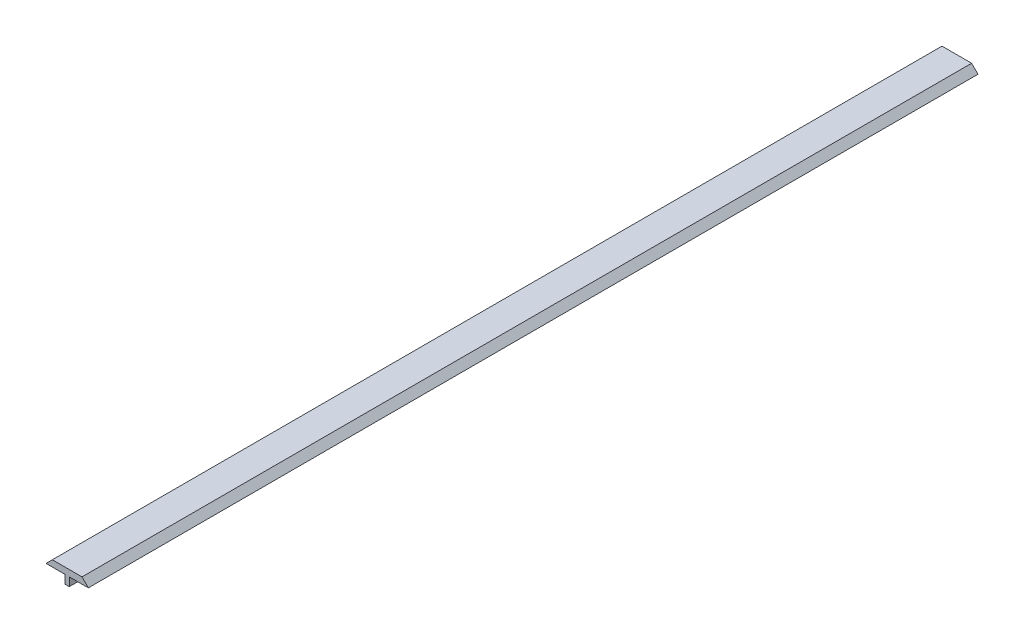
ISO-10303-21;
HEADER;
FILE_DESCRIPTION(('STEP AP214'),'2;1');
FILE_NAME('part.step','',(''),(''),'','','');
FILE_SCHEMA(('AUTOMOTIVE_DESIGN { 1 0 10303 214 1 1 1 1 }'));
ENDSEC;
DATA;
#1=APPLICATION_CONTEXT('core data for automotive mechanical design processes');
#2=APPLICATION_PROTOCOL_DEFINITION('international standard','automotive_design',2000,#1);
#3=PRODUCT_CONTEXT('',#1,'mechanical');
#4=PRODUCT('Part','Part','',(#3));
#5=PRODUCT_RELATED_PRODUCT_CATEGORY('part','',(#4));
#6=PRODUCT_DEFINITION_FORMATION('','',#4);
#7=PRODUCT_DEFINITION_CONTEXT('part definition',#1,'design');
#8=PRODUCT_DEFINITION('design','',#6,#7);
#9=PRODUCT_DEFINITION_SHAPE('','',#8);
#10=(LENGTH_UNIT() NAMED_UNIT(*) SI_UNIT(.MILLI.,.METRE.));
#11=(NAMED_UNIT(*) PLANE_ANGLE_UNIT() SI_UNIT($,.RADIAN.));
#12=(NAMED_UNIT(*) SI_UNIT($,.STERADIAN.) SOLID_ANGLE_UNIT());
#13=UNCERTAINTY_MEASURE_WITH_UNIT(LENGTH_MEASURE(1.E-05),#10,'distance_accuracy_value','');
#14=(GEOMETRIC_REPRESENTATION_CONTEXT(3) GLOBAL_UNCERTAINTY_ASSIGNED_CONTEXT((#13)) GLOBAL_UNIT_ASSIGNED_CONTEXT((#10,
#11,#12)) REPRESENTATION_CONTEXT('',''));
#15=CARTESIAN_POINT('',(0.,0.,0.));
#16=DIRECTION('',(0.,0.,1.));
#17=DIRECTION('',(1.,0.,0.));
#18=AXIS2_PLACEMENT_3D('',#15,#16,#17);
#19=CARTESIAN_POINT('',(0.,2.,210.));
#20=DIRECTION('',(1.,0.,0.));
#21=DIRECTION('',(0.,0.,-1.));
#22=AXIS2_PLACEMENT_3D('',#19,#20,#21);
#23=PLANE('',#22);
#24=DIRECTION('',(0.,-1.,0.));
#25=VECTOR('',#24,1.);
#26=CARTESIAN_POINT('',(0.,2.,0.));
#27=LINE('',#26,#25);
#28=CARTESIAN_POINT('',(0.,2.,0.));
#29=VERTEX_POINT('',#28);
#30=CARTESIAN_POINT('',(0.,0.,0.));
#31=VERTEX_POINT('',#30);
#32=EDGE_CURVE('E146',#29,#31,#27,.T.);
#33=ORIENTED_EDGE('',*,*,#32,.T.);
#34=DIRECTION('',(0.,0.,-1.));
#35=VECTOR('',#34,1.);
#36=CARTESIAN_POINT('',(0.,0.,210.));
#37=LINE('',#36,#35);
#38=CARTESIAN_POINT('',(0.,0.,210.));
#39=VERTEX_POINT('',#38);
#40=EDGE_CURVE('E11',#39,#31,#37,.T.);
#41=ORIENTED_EDGE('',*,*,#40,.F.);
#42=DIRECTION('',(0.,-1.,0.));
#43=VECTOR('',#42,1.);
#44=CARTESIAN_POINT('',(0.,2.,210.));
#45=LINE('',#44,#43);
#46=CARTESIAN_POINT('',(0.,2.,210.));
#47=VERTEX_POINT('',#46);
#48=EDGE_CURVE('E168',#47,#39,#45,.T.);
#49=ORIENTED_EDGE('',*,*,#48,.F.);
#50=DIRECTION('',(0.,0.,-1.));
#51=VECTOR('',#50,1.);
#52=CARTESIAN_POINT('',(0.,2.,210.));
#53=LINE('',#52,#51);
#54=EDGE_CURVE('E142',#47,#29,#53,.T.);
#55=ORIENTED_EDGE('',*,*,#54,.T.);
#56=EDGE_LOOP('',(#33,#41,#49,#55));
#57=FACE_BOUND('',#56,.T.);
#58=ADVANCED_FACE('F45',(#57),#23,.F.);
#59=CARTESIAN_POINT('',(0.,0.,210.));
#60=DIRECTION('',(0.,1.,0.));
#61=DIRECTION('',(0.,0.,1.));
#62=AXIS2_PLACEMENT_3D('',#59,#60,#61);
#63=PLANE('',#62);
#64=DIRECTION('',(1.,0.,0.));
#65=VECTOR('',#64,1.);
#66=CARTESIAN_POINT('',(0.,0.,0.));
#67=LINE('',#66,#65);
#68=CARTESIAN_POINT('',(1.,0.,0.));
#69=VERTEX_POINT('',#68);
#70=EDGE_CURVE('E150',#31,#69,#67,.T.);
#71=ORIENTED_EDGE('',*,*,#70,.T.);
#72=DIRECTION('',(0.,0.,-1.));
#73=VECTOR('',#72,1.);
#74=CARTESIAN_POINT('',(1.,0.,210.));
#75=LINE('',#74,#73);
#76=CARTESIAN_POINT('',(1.,0.,210.));
#77=VERTEX_POINT('',#76);
#78=EDGE_CURVE('E54',#77,#69,#75,.T.);
#79=ORIENTED_EDGE('',*,*,#78,.F.);
#80=DIRECTION('',(1.,0.,0.));
#81=VECTOR('',#80,1.);
#82=CARTESIAN_POINT('',(0.,0.,210.));
#83=LINE('',#82,#81);
#84=EDGE_CURVE('E105',#39,#77,#83,.T.);
#85=ORIENTED_EDGE('',*,*,#84,.F.);
#86=ORIENTED_EDGE('',*,*,#40,.T.);
#87=EDGE_LOOP('',(#71,#79,#85,#86));
#88=FACE_BOUND('',#87,.T.);
#89=ADVANCED_FACE('F214',(#88),#63,.F.);
#90=CARTESIAN_POINT('',(1.,0.,210.));
#91=DIRECTION('',(-1.,0.,0.));
#92=DIRECTION('',(0.,0.,1.));
#93=AXIS2_PLACEMENT_3D('',#90,#91,#92);
#94=PLANE('',#93);
#95=DIRECTION('',(0.,1.,0.));
#96=VECTOR('',#95,1.);
#97=CARTESIAN_POINT('',(1.,0.,0.));
#98=LINE('',#97,#96);
#99=CARTESIAN_POINT('',(1.,2.,0.));
#100=VERTEX_POINT('',#99);
#101=EDGE_CURVE('E153',#69,#100,#98,.T.);
#102=ORIENTED_EDGE('',*,*,#101,.T.);
#103=DIRECTION('',(0.,0.,-1.));
#104=VECTOR('',#103,1.);
#105=CARTESIAN_POINT('',(1.,2.,210.));
#106=LINE('',#105,#104);
#107=CARTESIAN_POINT('',(1.,2.,210.));
#108=VERTEX_POINT('',#107);
#109=EDGE_CURVE('E179',#108,#100,#106,.T.);
#110=ORIENTED_EDGE('',*,*,#109,.F.);
#111=DIRECTION('',(0.,1.,0.));
#112=VECTOR('',#111,1.);
#113=CARTESIAN_POINT('',(1.,0.,210.));
#114=LINE('',#113,#112);
#115=EDGE_CURVE('E189',#77,#108,#114,.T.);
#116=ORIENTED_EDGE('',*,*,#115,.F.);
#117=ORIENTED_EDGE('',*,*,#78,.T.);
#118=EDGE_LOOP('',(#102,#110,#116,#117));
#119=FACE_BOUND('',#118,.T.);
#120=ADVANCED_FACE('F187',(#119),#94,.F.);
#121=CARTESIAN_POINT('',(1.,2.,210.));
#122=DIRECTION('',(0.,1.,0.));
#123=DIRECTION('',(0.,0.,1.));
#124=AXIS2_PLACEMENT_3D('',#121,#122,#123);
#125=PLANE('',#124);
#126=DIRECTION('',(1.,0.,0.));
#127=VECTOR('',#126,1.);
#128=CARTESIAN_POINT('',(1.,2.,0.));
#129=LINE('',#128,#127);
#130=CARTESIAN_POINT('',(5.5,2.,0.));
#131=VERTEX_POINT('',#130);
#132=EDGE_CURVE('E156',#100,#131,#129,.T.);
#133=ORIENTED_EDGE('',*,*,#132,.T.);
#134=DIRECTION('',(0.,0.,-1.));
#135=VECTOR('',#134,1.);
#136=CARTESIAN_POINT('',(5.5,2.,210.));
#137=LINE('',#136,#135);
#138=CARTESIAN_POINT('',(5.5,2.,210.));
#139=VERTEX_POINT('',#138);
#140=EDGE_CURVE('E175',#139,#131,#137,.T.);
#141=ORIENTED_EDGE('',*,*,#140,.F.);
#142=DIRECTION('',(1.,0.,0.));
#143=VECTOR('',#142,1.);
#144=CARTESIAN_POINT('',(1.,2.,210.));
#145=LINE('',#144,#143);
#146=EDGE_CURVE('E202',#108,#139,#145,.T.);
#147=ORIENTED_EDGE('',*,*,#146,.F.);
#148=ORIENTED_EDGE('',*,*,#109,.T.);
#149=EDGE_LOOP('',(#133,#141,#147,#148));
#150=FACE_BOUND('',#149,.T.);
#151=ADVANCED_FACE('F197',(#150),#125,.F.);
#152=CARTESIAN_POINT('',(5.5,2.,210.));
#153=DIRECTION('',(-0.707106781186547,-0.707106781186548,0.));
#154=DIRECTION('',(0.707106781186548,-0.707106781186547,0.));
#155=AXIS2_PLACEMENT_3D('',#152,#153,#154);
#156=PLANE('',#155);
#157=DIRECTION('',(-0.707106781186548,0.707106781186547,0.));
#158=VECTOR('',#157,1.);
#159=CARTESIAN_POINT('',(5.5,2.,0.));
#160=LINE('',#159,#158);
#161=CARTESIAN_POINT('',(4.,3.5,0.));
#162=VERTEX_POINT('',#161);
#163=EDGE_CURVE('E159',#131,#162,#160,.T.);
#164=ORIENTED_EDGE('',*,*,#163,.T.);
#165=DIRECTION('',(0.,0.,-1.));
#166=VECTOR('',#165,1.);
#167=CARTESIAN_POINT('',(4.,3.5,210.));
#168=LINE('',#167,#166);
#169=CARTESIAN_POINT('',(4.,3.5,210.));
#170=VERTEX_POINT('',#169);
#171=EDGE_CURVE('E135',#170,#162,#168,.T.);
#172=ORIENTED_EDGE('',*,*,#171,.F.);
#173=DIRECTION('',(-0.707106781186548,0.707106781186547,0.));
#174=VECTOR('',#173,1.);
#175=CARTESIAN_POINT('',(5.5,2.,210.));
#176=LINE('',#175,#174);
#177=EDGE_CURVE('E124',#139,#170,#176,.T.);
#178=ORIENTED_EDGE('',*,*,#177,.F.);
#179=ORIENTED_EDGE('',*,*,#140,.T.);
#180=EDGE_LOOP('',(#164,#172,#178,#179));
#181=FACE_BOUND('',#180,.T.);
#182=ADVANCED_FACE('F200',(#181),#156,.F.);
#183=CARTESIAN_POINT('',(4.,3.5,210.));
#184=DIRECTION('',(0.,-1.,0.));
#185=DIRECTION('',(0.,0.,-1.));
#186=AXIS2_PLACEMENT_3D('',#183,#184,#185);
#187=PLANE('',#186);
#188=DIRECTION('',(-1.,0.,0.));
#189=VECTOR('',#188,1.);
#190=CARTESIAN_POINT('',(4.,3.5,0.));
#191=LINE('',#190,#189);
#192=CARTESIAN_POINT('',(-3.,3.5,0.));
#193=VERTEX_POINT('',#192);
#194=EDGE_CURVE('E133',#162,#193,#191,.T.);
#195=ORIENTED_EDGE('',*,*,#194,.T.);
#196=DIRECTION('',(0.,0.,-1.));
#197=VECTOR('',#196,1.);
#198=CARTESIAN_POINT('',(-3.,3.5,210.));
#199=LINE('',#198,#197);
#200=CARTESIAN_POINT('',(-3.,3.5,210.));
#201=VERTEX_POINT('',#200);
#202=EDGE_CURVE('E130',#201,#193,#199,.T.);
#203=ORIENTED_EDGE('',*,*,#202,.F.);
#204=DIRECTION('',(-1.,0.,0.));
#205=VECTOR('',#204,1.);
#206=CARTESIAN_POINT('',(4.,3.5,210.));
#207=LINE('',#206,#205);
#208=EDGE_CURVE('E118',#170,#201,#207,.T.);
#209=ORIENTED_EDGE('',*,*,#208,.F.);
#210=ORIENTED_EDGE('',*,*,#171,.T.);
#211=EDGE_LOOP('',(#195,#203,#209,#210));
#212=FACE_BOUND('',#211,.T.);
#213=ADVANCED_FACE('F131',(#212),#187,.F.);
#214=CARTESIAN_POINT('',(-3.,3.5,210.));
#215=DIRECTION('',(0.707106781186547,-0.707106781186548,0.));
#216=DIRECTION('',(0.707106781186548,0.707106781186547,0.));
#217=AXIS2_PLACEMENT_3D('',#214,#215,#216);
#218=PLANE('',#217);
#219=DIRECTION('',(-0.707106781186548,-0.707106781186547,0.));
#220=VECTOR('',#219,1.);
#221=CARTESIAN_POINT('',(-3.,3.5,0.));
#222=LINE('',#221,#220);
#223=CARTESIAN_POINT('',(-4.5,2.,0.));
#224=VERTEX_POINT('',#223);
#225=EDGE_CURVE('E91',#193,#224,#222,.T.);
#226=ORIENTED_EDGE('',*,*,#225,.T.);
#227=DIRECTION('',(0.,0.,-1.));
#228=VECTOR('',#227,1.);
#229=CARTESIAN_POINT('',(-4.5,2.,210.));
#230=LINE('',#229,#228);
#231=CARTESIAN_POINT('',(-4.5,2.,210.));
#232=VERTEX_POINT('',#231);
#233=EDGE_CURVE('E136',#232,#224,#230,.T.);
#234=ORIENTED_EDGE('',*,*,#233,.F.);
#235=DIRECTION('',(-0.707106781186548,-0.707106781186547,0.));
#236=VECTOR('',#235,1.);
#237=CARTESIAN_POINT('',(-3.,3.5,210.));
#238=LINE('',#237,#236);
#239=EDGE_CURVE('E122',#201,#232,#238,.T.);
#240=ORIENTED_EDGE('',*,*,#239,.F.);
#241=ORIENTED_EDGE('',*,*,#202,.T.);
#242=EDGE_LOOP('',(#226,#234,#240,#241));
#243=FACE_BOUND('',#242,.T.);
#244=ADVANCED_FACE('F138',(#243),#218,.F.);
#245=CARTESIAN_POINT('',(-4.5,2.,210.));
#246=DIRECTION('',(0.,1.,0.));
#247=DIRECTION('',(0.,0.,1.));
#248=AXIS2_PLACEMENT_3D('',#245,#246,#247);
#249=PLANE('',#248);
#250=DIRECTION('',(1.,0.,0.));
#251=VECTOR('',#250,1.);
#252=CARTESIAN_POINT('',(-4.5,2.,0.));
#253=LINE('',#252,#251);
#254=EDGE_CURVE('E97',#224,#29,#253,.T.);
#255=ORIENTED_EDGE('',*,*,#254,.T.);
#256=ORIENTED_EDGE('',*,*,#54,.F.);
#257=DIRECTION('',(1.,0.,0.));
#258=VECTOR('',#257,1.);
#259=CARTESIAN_POINT('',(-4.5,2.,210.));
#260=LINE('',#259,#258);
#261=EDGE_CURVE('E62',#232,#47,#260,.T.);
#262=ORIENTED_EDGE('',*,*,#261,.F.);
#263=ORIENTED_EDGE('',*,*,#233,.T.);
#264=EDGE_LOOP('',(#255,#256,#262,#263));
#265=FACE_BOUND('',#264,.T.);
#266=ADVANCED_FACE('F230',(#265),#249,.F.);
#267=CARTESIAN_POINT('',(0.,0.,210.));
#268=DIRECTION('',(0.,0.,1.));
#269=DIRECTION('',(1.,0.,0.));
#270=AXIS2_PLACEMENT_3D('',#267,#268,#269);
#271=PLANE('',#270);
#272=ORIENTED_EDGE('',*,*,#48,.T.);
#273=ORIENTED_EDGE('',*,*,#84,.T.);
#274=ORIENTED_EDGE('',*,*,#115,.T.);
#275=ORIENTED_EDGE('',*,*,#146,.T.);
#276=ORIENTED_EDGE('',*,*,#177,.T.);
#277=ORIENTED_EDGE('',*,*,#208,.T.);
#278=ORIENTED_EDGE('',*,*,#239,.T.);
#279=ORIENTED_EDGE('',*,*,#261,.T.);
#280=EDGE_LOOP('',(#272,#273,#274,#275,#276,#277,#278,#279));
#281=FACE_BOUND('',#280,.T.);
#282=ADVANCED_FACE('F120',(#281),#271,.T.);
#283=CARTESIAN_POINT('',(0.,0.,0.));
#284=DIRECTION('',(0.,0.,1.));
#285=DIRECTION('',(1.,0.,0.));
#286=AXIS2_PLACEMENT_3D('',#283,#284,#285);
#287=PLANE('',#286);
#288=ORIENTED_EDGE('',*,*,#32,.F.);
#289=ORIENTED_EDGE('',*,*,#254,.F.);
#290=ORIENTED_EDGE('',*,*,#225,.F.);
#291=ORIENTED_EDGE('',*,*,#194,.F.);
#292=ORIENTED_EDGE('',*,*,#163,.F.);
#293=ORIENTED_EDGE('',*,*,#132,.F.);
#294=ORIENTED_EDGE('',*,*,#101,.F.);
#295=ORIENTED_EDGE('',*,*,#70,.F.);
#296=EDGE_LOOP('',(#288,#289,#290,#291,#292,#293,#294,#295));
#297=FACE_BOUND('',#296,.T.);
#298=ADVANCED_FACE('F193',(#297),#287,.F.);
#299=CLOSED_SHELL('',(#58,#89,#120,#151,#182,#213,#244,#266,#282,#298));
#300=MANIFOLD_SOLID_BREP('B2',#299);
#301=ADVANCED_BREP_SHAPE_REPRESENTATION('',(#18,#300),#14);
#302=SHAPE_DEFINITION_REPRESENTATION(#9,#301);
ENDSEC;
END-ISO-10303-21;
